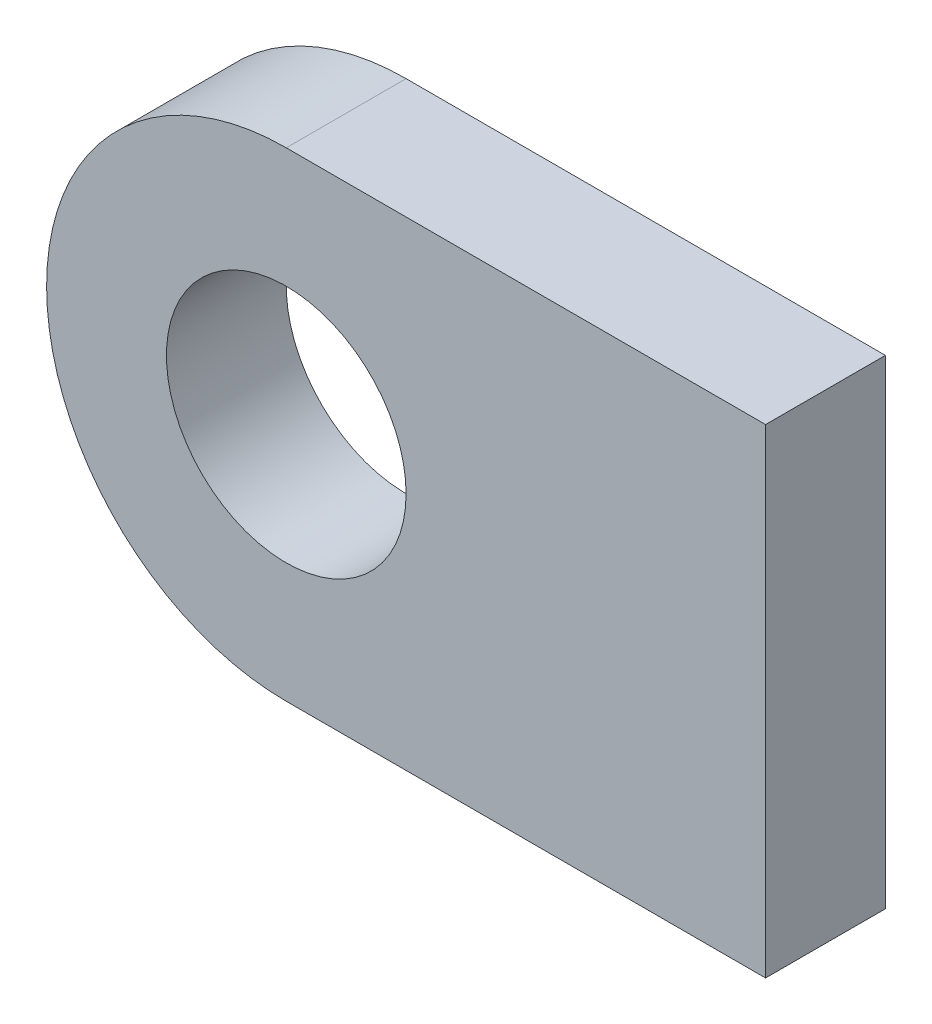
ISO-10303-21;
HEADER;
FILE_DESCRIPTION(('STEP AP214'),'2;1');
FILE_NAME('part.step','',(''),(''),'','','');
FILE_SCHEMA(('AUTOMOTIVE_DESIGN { 1 0 10303 214 1 1 1 1 }'));
ENDSEC;
DATA;
#1=APPLICATION_CONTEXT('core data for automotive mechanical design processes');
#2=APPLICATION_PROTOCOL_DEFINITION('international standard','automotive_design',2000,#1);
#3=PRODUCT_CONTEXT('',#1,'mechanical');
#4=PRODUCT('Part','Part','',(#3));
#5=PRODUCT_RELATED_PRODUCT_CATEGORY('part','',(#4));
#6=PRODUCT_DEFINITION_FORMATION('','',#4);
#7=PRODUCT_DEFINITION_CONTEXT('part definition',#1,'design');
#8=PRODUCT_DEFINITION('design','',#6,#7);
#9=PRODUCT_DEFINITION_SHAPE('','',#8);
#10=(LENGTH_UNIT() NAMED_UNIT(*) SI_UNIT(.MILLI.,.METRE.));
#11=(NAMED_UNIT(*) PLANE_ANGLE_UNIT() SI_UNIT($,.RADIAN.));
#12=(NAMED_UNIT(*) SI_UNIT($,.STERADIAN.) SOLID_ANGLE_UNIT());
#13=UNCERTAINTY_MEASURE_WITH_UNIT(LENGTH_MEASURE(1.E-05),#10,'distance_accuracy_value','');
#14=(GEOMETRIC_REPRESENTATION_CONTEXT(3) GLOBAL_UNCERTAINTY_ASSIGNED_CONTEXT((#13)) GLOBAL_UNIT_ASSIGNED_CONTEXT((#10,
#11,#12)) REPRESENTATION_CONTEXT('',''));
#15=CARTESIAN_POINT('',(0.,0.,0.));
#16=DIRECTION('',(0.,0.,1.));
#17=DIRECTION('',(1.,0.,0.));
#18=AXIS2_PLACEMENT_3D('',#15,#16,#17);
#19=CARTESIAN_POINT('',(-33.5488902970877,0.,5.));
#20=DIRECTION('',(0.,0.,-1.));
#21=DIRECTION('',(-1.,0.,0.));
#22=AXIS2_PLACEMENT_3D('',#19,#20,#21);
#23=CYLINDRICAL_SURFACE('',#22,10.);
#24=CARTESIAN_POINT('',(-33.5488902970877,0.,0.));
#25=DIRECTION('',(0.,0.,1.));
#26=DIRECTION('',(1.,0.,0.));
#27=AXIS2_PLACEMENT_3D('',#24,#25,#26);
#28=CIRCLE('',#27,10.);
#29=CARTESIAN_POINT('',(-33.5488902970877,10.,0.));
#30=VERTEX_POINT('',#29);
#31=CARTESIAN_POINT('',(-33.5488902970877,-10.,0.));
#32=VERTEX_POINT('',#31);
#33=EDGE_CURVE('E98',#30,#32,#28,.T.);
#34=ORIENTED_EDGE('',*,*,#33,.T.);
#35=DIRECTION('',(0.,0.,-1.));
#36=VECTOR('',#35,1.);
#37=CARTESIAN_POINT('',(-33.5488902970877,-10.,5.));
#38=LINE('',#37,#36);
#39=CARTESIAN_POINT('',(-33.5488902970877,-10.,5.));
#40=VERTEX_POINT('',#39);
#41=EDGE_CURVE('E11',#40,#32,#38,.T.);
#42=ORIENTED_EDGE('',*,*,#41,.F.);
#43=CARTESIAN_POINT('',(-33.5488902970877,0.,5.));
#44=DIRECTION('',(0.,0.,1.));
#45=DIRECTION('',(1.,0.,0.));
#46=AXIS2_PLACEMENT_3D('',#43,#44,#45);
#47=CIRCLE('',#46,10.);
#48=CARTESIAN_POINT('',(-33.5488902970877,10.,5.));
#49=VERTEX_POINT('',#48);
#50=EDGE_CURVE('E84',#49,#40,#47,.T.);
#51=ORIENTED_EDGE('',*,*,#50,.F.);
#52=DIRECTION('',(0.,0.,-1.));
#53=VECTOR('',#52,1.);
#54=CARTESIAN_POINT('',(-33.5488902970877,10.,5.));
#55=LINE('',#54,#53);
#56=EDGE_CURVE('E51',#49,#30,#55,.T.);
#57=ORIENTED_EDGE('',*,*,#56,.T.);
#58=EDGE_LOOP('',(#34,#42,#51,#57));
#59=FACE_BOUND('',#58,.T.);
#60=ADVANCED_FACE('F35',(#59),#23,.T.);
#61=CARTESIAN_POINT('',(-33.5488902970877,-10.,5.));
#62=DIRECTION('',(0.,1.,0.));
#63=DIRECTION('',(0.,0.,1.));
#64=AXIS2_PLACEMENT_3D('',#61,#62,#63);
#65=PLANE('',#64);
#66=DIRECTION('',(1.,0.,0.));
#67=VECTOR('',#66,1.);
#68=CARTESIAN_POINT('',(-33.5488902970877,-10.,0.));
#69=LINE('',#68,#67);
#70=CARTESIAN_POINT('',(-13.5488902970877,-10.,0.));
#71=VERTEX_POINT('',#70);
#72=EDGE_CURVE('E89',#32,#71,#69,.T.);
#73=ORIENTED_EDGE('',*,*,#72,.T.);
#74=DIRECTION('',(0.,0.,-1.));
#75=VECTOR('',#74,1.);
#76=CARTESIAN_POINT('',(-13.5488902970877,-10.,5.));
#77=LINE('',#76,#75);
#78=CARTESIAN_POINT('',(-13.5488902970877,-10.,5.));
#79=VERTEX_POINT('',#78);
#80=EDGE_CURVE('E43',#79,#71,#77,.T.);
#81=ORIENTED_EDGE('',*,*,#80,.F.);
#82=DIRECTION('',(1.,0.,0.));
#83=VECTOR('',#82,1.);
#84=CARTESIAN_POINT('',(-33.5488902970877,-10.,5.));
#85=LINE('',#84,#83);
#86=EDGE_CURVE('E76',#40,#79,#85,.T.);
#87=ORIENTED_EDGE('',*,*,#86,.F.);
#88=ORIENTED_EDGE('',*,*,#41,.T.);
#89=EDGE_LOOP('',(#73,#81,#87,#88));
#90=FACE_BOUND('',#89,.T.);
#91=ADVANCED_FACE('F88',(#90),#65,.F.);
#92=CARTESIAN_POINT('',(-13.5488902970877,10.,5.));
#93=DIRECTION('',(1.,0.,0.));
#94=DIRECTION('',(0.,1.,0.));
#95=AXIS2_PLACEMENT_3D('',#92,#93,#94);
#96=PLANE('',#95);
#97=DIRECTION('',(0.,-1.,0.));
#98=VECTOR('',#97,1.);
#99=CARTESIAN_POINT('',(-13.5488902970877,10.,0.));
#100=LINE('',#99,#98);
#101=CARTESIAN_POINT('',(-13.5488902970877,10.,0.));
#102=VERTEX_POINT('',#101);
#103=EDGE_CURVE('E102',#102,#71,#100,.T.);
#104=ORIENTED_EDGE('',*,*,#103,.F.);
#105=DIRECTION('',(0.,0.,-1.));
#106=VECTOR('',#105,1.);
#107=CARTESIAN_POINT('',(-13.5488902970877,10.,5.));
#108=LINE('',#107,#106);
#109=CARTESIAN_POINT('',(-13.5488902970877,10.,5.));
#110=VERTEX_POINT('',#109);
#111=EDGE_CURVE('E65',#110,#102,#108,.T.);
#112=ORIENTED_EDGE('',*,*,#111,.F.);
#113=DIRECTION('',(0.,-1.,0.));
#114=VECTOR('',#113,1.);
#115=CARTESIAN_POINT('',(-13.5488902970877,10.,5.));
#116=LINE('',#115,#114);
#117=EDGE_CURVE('E83',#110,#79,#116,.T.);
#118=ORIENTED_EDGE('',*,*,#117,.T.);
#119=ORIENTED_EDGE('',*,*,#80,.T.);
#120=EDGE_LOOP('',(#104,#112,#118,#119));
#121=FACE_BOUND('',#120,.T.);
#122=ADVANCED_FACE('F92',(#121),#96,.T.);
#123=CARTESIAN_POINT('',(-33.5488902970877,10.,5.));
#124=DIRECTION('',(0.,1.,0.));
#125=DIRECTION('',(0.,0.,1.));
#126=AXIS2_PLACEMENT_3D('',#123,#124,#125);
#127=PLANE('',#126);
#128=DIRECTION('',(1.,0.,0.));
#129=VECTOR('',#128,1.);
#130=CARTESIAN_POINT('',(-33.5488902970877,10.,0.));
#131=LINE('',#130,#129);
#132=EDGE_CURVE('E104',#30,#102,#131,.T.);
#133=ORIENTED_EDGE('',*,*,#132,.F.);
#134=ORIENTED_EDGE('',*,*,#56,.F.);
#135=DIRECTION('',(1.,0.,0.));
#136=VECTOR('',#135,1.);
#137=CARTESIAN_POINT('',(-33.5488902970877,10.,5.));
#138=LINE('',#137,#136);
#139=EDGE_CURVE('E93',#49,#110,#138,.T.);
#140=ORIENTED_EDGE('',*,*,#139,.T.);
#141=ORIENTED_EDGE('',*,*,#111,.T.);
#142=EDGE_LOOP('',(#133,#134,#140,#141));
#143=FACE_BOUND('',#142,.T.);
#144=ADVANCED_FACE('F121',(#143),#127,.T.);
#145=CARTESIAN_POINT('',(-33.5488902970877,0.,5.));
#146=DIRECTION('',(0.,0.,1.));
#147=DIRECTION('',(1.,0.,0.));
#148=AXIS2_PLACEMENT_3D('',#145,#146,#147);
#149=PLANE('',#148);
#150=CARTESIAN_POINT('',(-33.5488902970877,0.,5.));
#151=DIRECTION('',(0.,0.,1.));
#152=DIRECTION('',(1.,0.,0.));
#153=AXIS2_PLACEMENT_3D('',#150,#151,#152);
#154=CIRCLE('',#153,5.);
#155=CARTESIAN_POINT('',(-28.5488902970877,0.,5.));
#156=VERTEX_POINT('',#155);
#157=EDGE_CURVE('E112',#156,#156,#154,.T.);
#158=ORIENTED_EDGE('',*,*,#157,.F.);
#159=EDGE_LOOP('',(#158));
#160=FACE_BOUND('',#159,.T.);
#161=ORIENTED_EDGE('',*,*,#50,.T.);
#162=ORIENTED_EDGE('',*,*,#86,.T.);
#163=ORIENTED_EDGE('',*,*,#117,.F.);
#164=ORIENTED_EDGE('',*,*,#139,.F.);
#165=EDGE_LOOP('',(#161,#162,#163,#164));
#166=FACE_BOUND('',#165,.T.);
#167=ADVANCED_FACE('F80',(#160,#166),#149,.T.);
#168=CARTESIAN_POINT('',(-33.5488902970877,0.,0.));
#169=DIRECTION('',(0.,0.,1.));
#170=DIRECTION('',(1.,0.,0.));
#171=AXIS2_PLACEMENT_3D('',#168,#169,#170);
#172=PLANE('',#171);
#173=CARTESIAN_POINT('',(-33.5488902970877,0.,0.));
#174=DIRECTION('',(0.,0.,1.));
#175=DIRECTION('',(1.,0.,0.));
#176=AXIS2_PLACEMENT_3D('',#173,#174,#175);
#177=CIRCLE('',#176,5.);
#178=CARTESIAN_POINT('',(-28.5488902970877,0.,0.));
#179=VERTEX_POINT('',#178);
#180=EDGE_CURVE('E100',#179,#179,#177,.T.);
#181=ORIENTED_EDGE('',*,*,#180,.T.);
#182=EDGE_LOOP('',(#181));
#183=FACE_BOUND('',#182,.T.);
#184=ORIENTED_EDGE('',*,*,#33,.F.);
#185=ORIENTED_EDGE('',*,*,#132,.T.);
#186=ORIENTED_EDGE('',*,*,#103,.T.);
#187=ORIENTED_EDGE('',*,*,#72,.F.);
#188=EDGE_LOOP('',(#184,#185,#186,#187));
#189=FACE_BOUND('',#188,.T.);
#190=ADVANCED_FACE('F120',(#183,#189),#172,.F.);
#191=CARTESIAN_POINT('',(-33.5488902970877,0.,5.));
#192=DIRECTION('',(0.,0.,1.));
#193=DIRECTION('',(1.,0.,0.));
#194=AXIS2_PLACEMENT_3D('',#191,#192,#193);
#195=CYLINDRICAL_SURFACE('',#194,5.);
#196=ORIENTED_EDGE('',*,*,#157,.T.);
#197=EDGE_LOOP('',(#196));
#198=FACE_BOUND('',#197,.T.);
#199=ORIENTED_EDGE('',*,*,#180,.F.);
#200=EDGE_LOOP('',(#199));
#201=FACE_BOUND('',#200,.T.);
#202=ADVANCED_FACE('F116',(#198,#201),#195,.F.);
#203=CLOSED_SHELL('',(#60,#91,#122,#144,#167,#190,#202));
#204=MANIFOLD_SOLID_BREP('B2',#203);
#205=ADVANCED_BREP_SHAPE_REPRESENTATION('',(#18,#204),#14);
#206=SHAPE_DEFINITION_REPRESENTATION(#9,#205);
ENDSEC;
END-ISO-10303-21;
